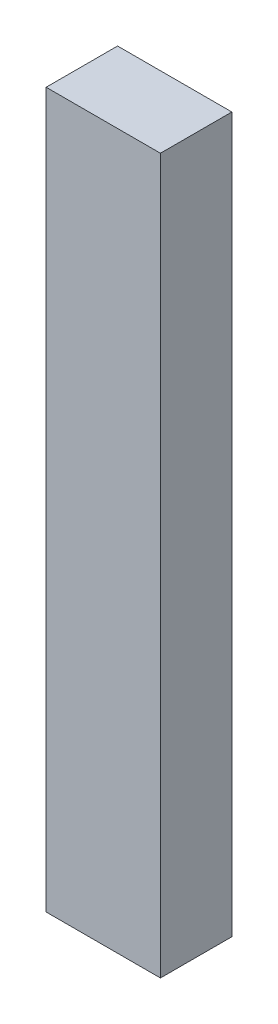
ISO-10303-21;
HEADER;
FILE_DESCRIPTION(('STEP AP214'),'2;1');
FILE_NAME('part.step','',(''),(''),'','','');
FILE_SCHEMA(('AUTOMOTIVE_DESIGN { 1 0 10303 214 1 1 1 1 }'));
ENDSEC;
DATA;
#1=APPLICATION_CONTEXT('core data for automotive mechanical design processes');
#2=APPLICATION_PROTOCOL_DEFINITION('international standard','automotive_design',2000,#1);
#3=PRODUCT_CONTEXT('',#1,'mechanical');
#4=PRODUCT('Part','Part','',(#3));
#5=PRODUCT_RELATED_PRODUCT_CATEGORY('part','',(#4));
#6=PRODUCT_DEFINITION_FORMATION('','',#4);
#7=PRODUCT_DEFINITION_CONTEXT('part definition',#1,'design');
#8=PRODUCT_DEFINITION('design','',#6,#7);
#9=PRODUCT_DEFINITION_SHAPE('','',#8);
#10=(LENGTH_UNIT() NAMED_UNIT(*) SI_UNIT(.MILLI.,.METRE.));
#11=(NAMED_UNIT(*) PLANE_ANGLE_UNIT() SI_UNIT($,.RADIAN.));
#12=(NAMED_UNIT(*) SI_UNIT($,.STERADIAN.) SOLID_ANGLE_UNIT());
#13=UNCERTAINTY_MEASURE_WITH_UNIT(LENGTH_MEASURE(1.E-05),#10,'distance_accuracy_value','');
#14=(GEOMETRIC_REPRESENTATION_CONTEXT(3) GLOBAL_UNCERTAINTY_ASSIGNED_CONTEXT((#13)) GLOBAL_UNIT_ASSIGNED_CONTEXT((#10,
#11,#12)) REPRESENTATION_CONTEXT('',''));
#15=CARTESIAN_POINT('',(0.,0.,0.));
#16=DIRECTION('',(0.,0.,1.));
#17=DIRECTION('',(1.,0.,0.));
#18=AXIS2_PLACEMENT_3D('',#15,#16,#17);
#19=CARTESIAN_POINT('',(75.,475.,-2.));
#20=DIRECTION('',(0.,0.,-1.));
#21=DIRECTION('',(0.,1.,0.));
#22=AXIS2_PLACEMENT_3D('',#19,#20,#21);
#23=PLANE('',#22);
#24=DIRECTION('',(-1.,0.,0.));
#25=VECTOR('',#24,1.);
#26=CARTESIAN_POINT('',(75.,473.,-2.));
#27=LINE('',#26,#25);
#28=CARTESIAN_POINT('',(73.,473.,-2.));
#29=VERTEX_POINT('',#28);
#30=CARTESIAN_POINT('',(-5.,473.,-2.));
#31=VERTEX_POINT('',#30);
#32=EDGE_CURVE('E78',#29,#31,#27,.T.);
#33=ORIENTED_EDGE('',*,*,#32,.F.);
#34=DIRECTION('',(0.,-1.,0.));
#35=VECTOR('',#34,1.);
#36=CARTESIAN_POINT('',(73.,475.,-2.));
#37=LINE('',#36,#35);
#38=CARTESIAN_POINT('',(73.,-23.,-2.00000000000004));
#39=VERTEX_POINT('',#38);
#40=EDGE_CURVE('E72',#29,#39,#37,.T.);
#41=ORIENTED_EDGE('',*,*,#40,.T.);
#42=DIRECTION('',(-1.,0.,0.));
#43=VECTOR('',#42,1.);
#44=CARTESIAN_POINT('',(75.,-23.,-2.00000000000004));
#45=LINE('',#44,#43);
#46=CARTESIAN_POINT('',(-5.,-23.,-2.00000000000004));
#47=VERTEX_POINT('',#46);
#48=EDGE_CURVE('E137',#39,#47,#45,.T.);
#49=ORIENTED_EDGE('',*,*,#48,.T.);
#50=DIRECTION('',(0.,-1.,0.));
#51=VECTOR('',#50,1.);
#52=CARTESIAN_POINT('',(-5.,475.,-2.));
#53=LINE('',#52,#51);
#54=EDGE_CURVE('E286',#31,#47,#53,.T.);
#55=ORIENTED_EDGE('',*,*,#54,.F.);
#56=EDGE_LOOP('',(#33,#41,#49,#55));
#57=FACE_BOUND('',#56,.T.);
#58=ADVANCED_FACE('F57',(#57),#23,.T.);
#59=CARTESIAN_POINT('',(75.,-23.,0.));
#60=DIRECTION('',(0.,1.,0.));
#61=DIRECTION('',(0.,0.,1.));
#62=AXIS2_PLACEMENT_3D('',#59,#60,#61);
#63=PLANE('',#62);
#64=ORIENTED_EDGE('',*,*,#48,.F.);
#65=DIRECTION('',(0.,0.,-1.));
#66=VECTOR('',#65,1.);
#67=CARTESIAN_POINT('',(73.,-23.,0.));
#68=LINE('',#67,#66);
#69=CARTESIAN_POINT('',(73.,-23.,-48.));
#70=VERTEX_POINT('',#69);
#71=EDGE_CURVE('E130',#39,#70,#68,.T.);
#72=ORIENTED_EDGE('',*,*,#71,.T.);
#73=DIRECTION('',(-1.,0.,0.));
#74=VECTOR('',#73,1.);
#75=CARTESIAN_POINT('',(75.,-23.,-48.));
#76=LINE('',#75,#74);
#77=CARTESIAN_POINT('',(-5.,-23.,-48.));
#78=VERTEX_POINT('',#77);
#79=EDGE_CURVE('E129',#70,#78,#76,.T.);
#80=ORIENTED_EDGE('',*,*,#79,.T.);
#81=DIRECTION('',(0.,0.,-1.));
#82=VECTOR('',#81,1.);
#83=CARTESIAN_POINT('',(-5.,-23.,0.));
#84=LINE('',#83,#82);
#85=EDGE_CURVE('E289',#47,#78,#84,.T.);
#86=ORIENTED_EDGE('',*,*,#85,.F.);
#87=EDGE_LOOP('',(#64,#72,#80,#86));
#88=FACE_BOUND('',#87,.T.);
#89=ADVANCED_FACE('F202',(#88),#63,.T.);
#90=CARTESIAN_POINT('',(75.,475.,-48.));
#91=DIRECTION('',(0.,0.,1.));
#92=DIRECTION('',(0.,-1.,0.));
#93=AXIS2_PLACEMENT_3D('',#90,#91,#92);
#94=PLANE('',#93);
#95=ORIENTED_EDGE('',*,*,#79,.F.);
#96=DIRECTION('',(0.,1.,0.));
#97=VECTOR('',#96,1.);
#98=CARTESIAN_POINT('',(73.,475.,-48.));
#99=LINE('',#98,#97);
#100=CARTESIAN_POINT('',(73.,473.,-48.));
#101=VERTEX_POINT('',#100);
#102=EDGE_CURVE('E121',#70,#101,#99,.T.);
#103=ORIENTED_EDGE('',*,*,#102,.T.);
#104=DIRECTION('',(-1.,0.,0.));
#105=VECTOR('',#104,1.);
#106=CARTESIAN_POINT('',(75.,473.,-48.));
#107=LINE('',#106,#105);
#108=CARTESIAN_POINT('',(-5.,473.,-48.));
#109=VERTEX_POINT('',#108);
#110=EDGE_CURVE('E128',#101,#109,#107,.T.);
#111=ORIENTED_EDGE('',*,*,#110,.T.);
#112=DIRECTION('',(0.,1.,0.));
#113=VECTOR('',#112,1.);
#114=CARTESIAN_POINT('',(-5.,475.,-48.));
#115=LINE('',#114,#113);
#116=EDGE_CURVE('E291',#78,#109,#115,.T.);
#117=ORIENTED_EDGE('',*,*,#116,.F.);
#118=EDGE_LOOP('',(#95,#103,#111,#117));
#119=FACE_BOUND('',#118,.T.);
#120=ADVANCED_FACE('F126',(#119),#94,.T.);
#121=CARTESIAN_POINT('',(75.,473.,0.));
#122=DIRECTION('',(0.,-1.,0.));
#123=DIRECTION('',(0.,0.,-1.));
#124=AXIS2_PLACEMENT_3D('',#121,#122,#123);
#125=PLANE('',#124);
#126=ORIENTED_EDGE('',*,*,#110,.F.);
#127=DIRECTION('',(0.,0.,1.));
#128=VECTOR('',#127,1.);
#129=CARTESIAN_POINT('',(73.,473.,0.));
#130=LINE('',#129,#128);
#131=EDGE_CURVE('E12',#101,#29,#130,.T.);
#132=ORIENTED_EDGE('',*,*,#131,.T.);
#133=ORIENTED_EDGE('',*,*,#32,.T.);
#134=DIRECTION('',(0.,0.,1.));
#135=VECTOR('',#134,1.);
#136=CARTESIAN_POINT('',(-5.,473.,0.));
#137=LINE('',#136,#135);
#138=EDGE_CURVE('E134',#109,#31,#137,.T.);
#139=ORIENTED_EDGE('',*,*,#138,.F.);
#140=EDGE_LOOP('',(#126,#132,#133,#139));
#141=FACE_BOUND('',#140,.T.);
#142=ADVANCED_FACE('F132',(#141),#125,.T.);
#143=CARTESIAN_POINT('',(75.,0.,0.));
#144=DIRECTION('',(1.,0.,0.));
#145=DIRECTION('',(0.,0.,-1.));
#146=AXIS2_PLACEMENT_3D('',#143,#144,#145);
#147=PLANE('',#146);
#148=DIRECTION('',(0.,-1.,0.));
#149=VECTOR('',#148,1.);
#150=CARTESIAN_POINT('',(75.,475.,0.));
#151=LINE('',#150,#149);
#152=CARTESIAN_POINT('',(75.,475.,0.));
#153=VERTEX_POINT('',#152);
#154=CARTESIAN_POINT('',(75.,-25.,0.));
#155=VERTEX_POINT('',#154);
#156=EDGE_CURVE('E144',#153,#155,#151,.T.);
#157=ORIENTED_EDGE('',*,*,#156,.T.);
#158=DIRECTION('',(0.,0.,-1.));
#159=VECTOR('',#158,1.);
#160=CARTESIAN_POINT('',(75.,-25.,0.));
#161=LINE('',#160,#159);
#162=CARTESIAN_POINT('',(75.,-25.,-50.));
#163=VERTEX_POINT('',#162);
#164=EDGE_CURVE('E147',#155,#163,#161,.T.);
#165=ORIENTED_EDGE('',*,*,#164,.T.);
#166=DIRECTION('',(0.,1.,0.));
#167=VECTOR('',#166,1.);
#168=CARTESIAN_POINT('',(75.,475.,-50.));
#169=LINE('',#168,#167);
#170=CARTESIAN_POINT('',(75.,475.,-50.));
#171=VERTEX_POINT('',#170);
#172=EDGE_CURVE('E150',#163,#171,#169,.T.);
#173=ORIENTED_EDGE('',*,*,#172,.T.);
#174=DIRECTION('',(0.,0.,1.));
#175=VECTOR('',#174,1.);
#176=CARTESIAN_POINT('',(75.,475.,0.));
#177=LINE('',#176,#175);
#178=EDGE_CURVE('E152',#171,#153,#177,.T.);
#179=ORIENTED_EDGE('',*,*,#178,.T.);
#180=EDGE_LOOP('',(#157,#165,#173,#179));
#181=FACE_BOUND('',#180,.T.);
#182=ADVANCED_FACE('F191',(#181),#147,.T.);
#183=CARTESIAN_POINT('',(-5.,0.,0.));
#184=DIRECTION('',(1.,0.,0.));
#185=DIRECTION('',(0.,0.,-1.));
#186=AXIS2_PLACEMENT_3D('',#183,#184,#185);
#187=PLANE('',#186);
#188=DIRECTION('',(0.,-1.,0.));
#189=VECTOR('',#188,1.);
#190=CARTESIAN_POINT('',(-5.,475.,0.));
#191=LINE('',#190,#189);
#192=CARTESIAN_POINT('',(-5.,475.,0.));
#193=VERTEX_POINT('',#192);
#194=CARTESIAN_POINT('',(-5.,-25.,0.));
#195=VERTEX_POINT('',#194);
#196=EDGE_CURVE('E143',#193,#195,#191,.T.);
#197=ORIENTED_EDGE('',*,*,#196,.F.);
#198=DIRECTION('',(0.,0.,1.));
#199=VECTOR('',#198,1.);
#200=CARTESIAN_POINT('',(-5.,475.,0.));
#201=LINE('',#200,#199);
#202=CARTESIAN_POINT('',(-5.,475.,-50.));
#203=VERTEX_POINT('',#202);
#204=EDGE_CURVE('E148',#203,#193,#201,.T.);
#205=ORIENTED_EDGE('',*,*,#204,.F.);
#206=DIRECTION('',(0.,1.,0.));
#207=VECTOR('',#206,1.);
#208=CARTESIAN_POINT('',(-5.,475.,-50.));
#209=LINE('',#208,#207);
#210=CARTESIAN_POINT('',(-5.,-25.,-50.));
#211=VERTEX_POINT('',#210);
#212=EDGE_CURVE('E160',#211,#203,#209,.T.);
#213=ORIENTED_EDGE('',*,*,#212,.F.);
#214=DIRECTION('',(0.,0.,-1.));
#215=VECTOR('',#214,1.);
#216=CARTESIAN_POINT('',(-5.,-25.,0.));
#217=LINE('',#216,#215);
#218=EDGE_CURVE('E157',#195,#211,#217,.T.);
#219=ORIENTED_EDGE('',*,*,#218,.F.);
#220=EDGE_LOOP('',(#197,#205,#213,#219));
#221=FACE_BOUND('',#220,.T.);
#222=ORIENTED_EDGE('',*,*,#54,.T.);
#223=ORIENTED_EDGE('',*,*,#85,.T.);
#224=ORIENTED_EDGE('',*,*,#116,.T.);
#225=ORIENTED_EDGE('',*,*,#138,.T.);
#226=EDGE_LOOP('',(#222,#223,#224,#225));
#227=FACE_BOUND('',#226,.T.);
#228=ADVANCED_FACE('F179',(#221,#227),#187,.F.);
#229=CARTESIAN_POINT('',(75.,475.,0.));
#230=DIRECTION('',(0.,0.,-1.));
#231=DIRECTION('',(0.,1.,0.));
#232=AXIS2_PLACEMENT_3D('',#229,#230,#231);
#233=PLANE('',#232);
#234=DIRECTION('',(-1.,0.,0.));
#235=VECTOR('',#234,1.);
#236=CARTESIAN_POINT('',(75.,475.,0.));
#237=LINE('',#236,#235);
#238=EDGE_CURVE('E154',#153,#193,#237,.T.);
#239=ORIENTED_EDGE('',*,*,#238,.T.);
#240=ORIENTED_EDGE('',*,*,#196,.T.);
#241=DIRECTION('',(-1.,0.,0.));
#242=VECTOR('',#241,1.);
#243=CARTESIAN_POINT('',(75.,-25.,0.));
#244=LINE('',#243,#242);
#245=EDGE_CURVE('E65',#155,#195,#244,.T.);
#246=ORIENTED_EDGE('',*,*,#245,.F.);
#247=ORIENTED_EDGE('',*,*,#156,.F.);
#248=EDGE_LOOP('',(#239,#240,#246,#247));
#249=FACE_BOUND('',#248,.T.);
#250=ADVANCED_FACE('F59',(#249),#233,.F.);
#251=CARTESIAN_POINT('',(75.,-25.,0.));
#252=DIRECTION('',(0.,1.,0.));
#253=DIRECTION('',(0.,0.,1.));
#254=AXIS2_PLACEMENT_3D('',#251,#252,#253);
#255=PLANE('',#254);
#256=ORIENTED_EDGE('',*,*,#245,.T.);
#257=ORIENTED_EDGE('',*,*,#218,.T.);
#258=DIRECTION('',(-1.,0.,0.));
#259=VECTOR('',#258,1.);
#260=CARTESIAN_POINT('',(75.,-25.,-50.));
#261=LINE('',#260,#259);
#262=EDGE_CURVE('E168',#163,#211,#261,.T.);
#263=ORIENTED_EDGE('',*,*,#262,.F.);
#264=ORIENTED_EDGE('',*,*,#164,.F.);
#265=EDGE_LOOP('',(#256,#257,#263,#264));
#266=FACE_BOUND('',#265,.T.);
#267=ADVANCED_FACE('F172',(#266),#255,.F.);
#268=CARTESIAN_POINT('',(75.,475.,-50.));
#269=DIRECTION('',(0.,0.,1.));
#270=DIRECTION('',(0.,-1.,0.));
#271=AXIS2_PLACEMENT_3D('',#268,#269,#270);
#272=PLANE('',#271);
#273=ORIENTED_EDGE('',*,*,#262,.T.);
#274=ORIENTED_EDGE('',*,*,#212,.T.);
#275=DIRECTION('',(-1.,0.,0.));
#276=VECTOR('',#275,1.);
#277=CARTESIAN_POINT('',(75.,475.,-50.));
#278=LINE('',#277,#276);
#279=EDGE_CURVE('E166',#171,#203,#278,.T.);
#280=ORIENTED_EDGE('',*,*,#279,.F.);
#281=ORIENTED_EDGE('',*,*,#172,.F.);
#282=EDGE_LOOP('',(#273,#274,#280,#281));
#283=FACE_BOUND('',#282,.T.);
#284=ADVANCED_FACE('F189',(#283),#272,.F.);
#285=CARTESIAN_POINT('',(75.,475.,0.));
#286=DIRECTION('',(0.,-1.,0.));
#287=DIRECTION('',(0.,0.,-1.));
#288=AXIS2_PLACEMENT_3D('',#285,#286,#287);
#289=PLANE('',#288);
#290=ORIENTED_EDGE('',*,*,#279,.T.);
#291=ORIENTED_EDGE('',*,*,#204,.T.);
#292=ORIENTED_EDGE('',*,*,#238,.F.);
#293=ORIENTED_EDGE('',*,*,#178,.F.);
#294=EDGE_LOOP('',(#290,#291,#292,#293));
#295=FACE_BOUND('',#294,.T.);
#296=ADVANCED_FACE('F185',(#295),#289,.F.);
#297=CARTESIAN_POINT('',(73.,0.,0.));
#298=DIRECTION('',(1.,0.,0.));
#299=DIRECTION('',(0.,0.,-1.));
#300=AXIS2_PLACEMENT_3D('',#297,#298,#299);
#301=PLANE('',#300);
#302=ORIENTED_EDGE('',*,*,#40,.F.);
#303=ORIENTED_EDGE('',*,*,#131,.F.);
#304=ORIENTED_EDGE('',*,*,#102,.F.);
#305=ORIENTED_EDGE('',*,*,#71,.F.);
#306=EDGE_LOOP('',(#302,#303,#304,#305));
#307=FACE_BOUND('',#306,.T.);
#308=ADVANCED_FACE('F120',(#307),#301,.F.);
#309=CLOSED_SHELL('',(#58,#89,#120,#142,#182,#228,#250,#267,#284,#296,#308));
#310=MANIFOLD_SOLID_BREP('B2',#309);
#311=ADVANCED_BREP_SHAPE_REPRESENTATION('',(#18,#310),#14);
#312=SHAPE_DEFINITION_REPRESENTATION(#9,#311);
ENDSEC;
END-ISO-10303-21;
